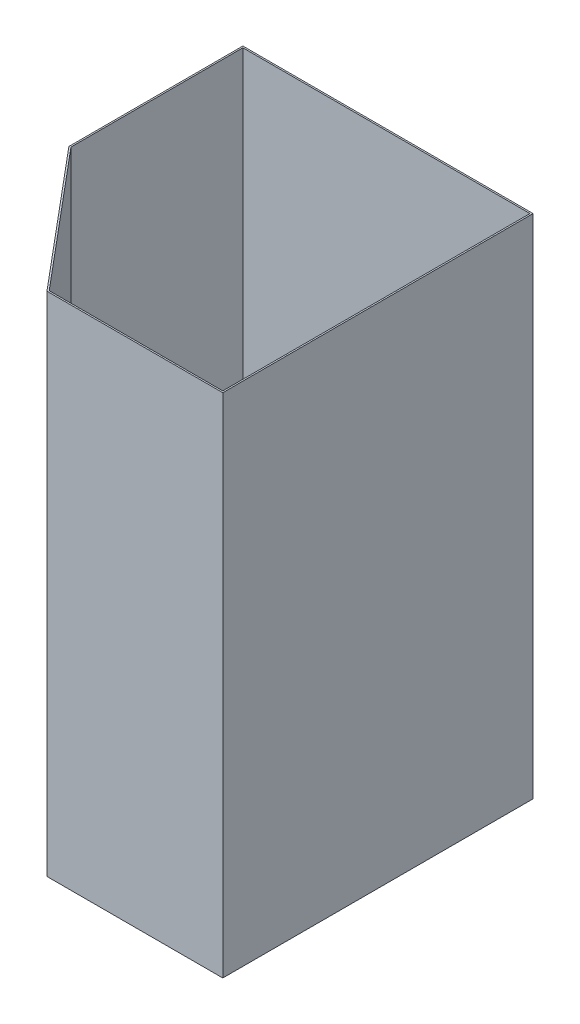
ISO-10303-21;
HEADER;
FILE_DESCRIPTION(('STEP AP214'),'2;1');
FILE_NAME('part.step','',(''),(''),'','','');
FILE_SCHEMA(('AUTOMOTIVE_DESIGN { 1 0 10303 214 1 1 1 1 }'));
ENDSEC;
DATA;
#1=APPLICATION_CONTEXT('core data for automotive mechanical design processes');
#2=APPLICATION_PROTOCOL_DEFINITION('international standard','automotive_design',2000,#1);
#3=PRODUCT_CONTEXT('',#1,'mechanical');
#4=PRODUCT('Part','Part','',(#3));
#5=PRODUCT_RELATED_PRODUCT_CATEGORY('part','',(#4));
#6=PRODUCT_DEFINITION_FORMATION('','',#4);
#7=PRODUCT_DEFINITION_CONTEXT('part definition',#1,'design');
#8=PRODUCT_DEFINITION('design','',#6,#7);
#9=PRODUCT_DEFINITION_SHAPE('','',#8);
#10=(LENGTH_UNIT() NAMED_UNIT(*) SI_UNIT(.MILLI.,.METRE.));
#11=(NAMED_UNIT(*) PLANE_ANGLE_UNIT() SI_UNIT($,.RADIAN.));
#12=(NAMED_UNIT(*) SI_UNIT($,.STERADIAN.) SOLID_ANGLE_UNIT());
#13=UNCERTAINTY_MEASURE_WITH_UNIT(LENGTH_MEASURE(1.E-05),#10,'distance_accuracy_value','');
#14=(GEOMETRIC_REPRESENTATION_CONTEXT(3) GLOBAL_UNCERTAINTY_ASSIGNED_CONTEXT((#13)) GLOBAL_UNIT_ASSIGNED_CONTEXT((#10,
#11,#12)) REPRESENTATION_CONTEXT('',''));
#15=CARTESIAN_POINT('',(0.,0.,0.));
#16=DIRECTION('',(0.,0.,1.));
#17=DIRECTION('',(1.,0.,0.));
#18=AXIS2_PLACEMENT_3D('',#15,#16,#17);
#19=CARTESIAN_POINT('',(0.,330.,0.));
#20=DIRECTION('',(0.,1.,0.));
#21=DIRECTION('',(0.,0.,1.));
#22=AXIS2_PLACEMENT_3D('',#19,#20,#21);
#23=PLANE('',#22);
#24=DIRECTION('',(0.,0.,-1.));
#25=VECTOR('',#24,1.);
#26=CARTESIAN_POINT('',(1.,330.,0.));
#27=LINE('',#26,#25);
#28=CARTESIAN_POINT('',(1.,330.,1.));
#29=VERTEX_POINT('',#28);
#30=CARTESIAN_POINT('',(1.,330.,-201.));
#31=VERTEX_POINT('',#30);
#32=EDGE_CURVE('E186',#29,#31,#27,.T.);
#33=ORIENTED_EDGE('',*,*,#32,.T.);
#34=DIRECTION('',(-1.,0.,0.));
#35=VECTOR('',#34,1.);
#36=CARTESIAN_POINT('',(0.,330.,-201.));
#37=LINE('',#36,#35);
#38=CARTESIAN_POINT('',(-187.920575113952,330.,-201.));
#39=VERTEX_POINT('',#38);
#40=EDGE_CURVE('E189',#31,#39,#37,.T.);
#41=ORIENTED_EDGE('',*,*,#40,.T.);
#42=DIRECTION('',(0.,0.,1.));
#43=VECTOR('',#42,1.);
#44=CARTESIAN_POINT('',(-187.920575113952,330.,0.));
#45=LINE('',#44,#43);
#46=CARTESIAN_POINT('',(-187.920575113952,330.,-87.7311407244164));
#47=VERTEX_POINT('',#46);
#48=EDGE_CURVE('E192',#39,#47,#45,.T.);
#49=ORIENTED_EDGE('',*,*,#48,.T.);
#50=DIRECTION('',(0.642787609686538,0.,0.766044443118979));
#51=VECTOR('',#50,1.);
#52=CARTESIAN_POINT('',(-67.0771664813008,330.,56.2844256548763));
#53=LINE('',#52,#51);
#54=CARTESIAN_POINT('',(-113.466307658155,330.,1.00000000000001));
#55=VERTEX_POINT('',#54);
#56=EDGE_CURVE('E194',#47,#55,#53,.T.);
#57=ORIENTED_EDGE('',*,*,#56,.T.);
#58=DIRECTION('',(1.,0.,0.));
#59=VECTOR('',#58,1.);
#60=CARTESIAN_POINT('',(0.,330.,1.));
#61=LINE('',#60,#59);
#62=EDGE_CURVE('E196',#55,#29,#61,.T.);
#63=ORIENTED_EDGE('',*,*,#62,.T.);
#64=EDGE_LOOP('',(#33,#41,#49,#57,#63));
#65=FACE_BOUND('',#64,.T.);
#66=DIRECTION('',(-1.,0.,0.));
#67=VECTOR('',#66,1.);
#68=CARTESIAN_POINT('',(-186.920575113952,330.,-200.));
#69=LINE('',#68,#67);
#70=CARTESIAN_POINT('',(0.,330.,-200.));
#71=VERTEX_POINT('',#70);
#72=CARTESIAN_POINT('',(-186.920575113952,330.,-200.));
#73=VERTEX_POINT('',#72);
#74=EDGE_CURVE('E150',#71,#73,#69,.T.);
#75=ORIENTED_EDGE('',*,*,#74,.F.);
#76=DIRECTION('',(0.,0.,-1.));
#77=VECTOR('',#76,1.);
#78=CARTESIAN_POINT('',(0.,330.,-200.));
#79=LINE('',#78,#77);
#80=CARTESIAN_POINT('',(0.,330.,0.));
#81=VERTEX_POINT('',#80);
#82=EDGE_CURVE('E142',#81,#71,#79,.T.);
#83=ORIENTED_EDGE('',*,*,#82,.F.);
#84=DIRECTION('',(1.,0.,0.));
#85=VECTOR('',#84,1.);
#86=CARTESIAN_POINT('',(0.,330.,0.));
#87=LINE('',#86,#85);
#88=CARTESIAN_POINT('',(-113.,330.,0.));
#89=VERTEX_POINT('',#88);
#90=EDGE_CURVE('E169',#89,#81,#87,.T.);
#91=ORIENTED_EDGE('',*,*,#90,.F.);
#92=DIRECTION('',(0.642787609686538,0.,0.766044443118979));
#93=VECTOR('',#92,1.);
#94=CARTESIAN_POINT('',(-113.,330.,0.));
#95=LINE('',#94,#93);
#96=CARTESIAN_POINT('',(-186.920575113952,330.,-88.0951109586826));
#97=VERTEX_POINT('',#96);
#98=EDGE_CURVE('E165',#97,#89,#95,.T.);
#99=ORIENTED_EDGE('',*,*,#98,.F.);
#100=DIRECTION('',(0.,0.,1.));
#101=VECTOR('',#100,1.);
#102=CARTESIAN_POINT('',(-186.920575113952,330.,-88.0951109586826));
#103=LINE('',#102,#101);
#104=EDGE_CURVE('E163',#73,#97,#103,.T.);
#105=ORIENTED_EDGE('',*,*,#104,.F.);
#106=EDGE_LOOP('',(#75,#83,#91,#99,#105));
#107=FACE_BOUND('',#106,.T.);
#108=ADVANCED_FACE('F65',(#65,#107),#23,.T.);
#109=CARTESIAN_POINT('',(0.,0.,0.));
#110=DIRECTION('',(0.,1.,0.));
#111=DIRECTION('',(0.,0.,1.));
#112=AXIS2_PLACEMENT_3D('',#109,#110,#111);
#113=PLANE('',#112);
#114=DIRECTION('',(0.,0.,-1.));
#115=VECTOR('',#114,1.);
#116=CARTESIAN_POINT('',(1.,0.,0.));
#117=LINE('',#116,#115);
#118=CARTESIAN_POINT('',(1.,0.,1.));
#119=VERTEX_POINT('',#118);
#120=CARTESIAN_POINT('',(1.,0.,-201.));
#121=VERTEX_POINT('',#120);
#122=EDGE_CURVE('E158',#119,#121,#117,.T.);
#123=ORIENTED_EDGE('',*,*,#122,.F.);
#124=DIRECTION('',(1.,0.,0.));
#125=VECTOR('',#124,1.);
#126=CARTESIAN_POINT('',(0.,0.,1.));
#127=LINE('',#126,#125);
#128=CARTESIAN_POINT('',(-113.466307658155,0.,1.00000000000001));
#129=VERTEX_POINT('',#128);
#130=EDGE_CURVE('E190',#129,#119,#127,.T.);
#131=ORIENTED_EDGE('',*,*,#130,.F.);
#132=DIRECTION('',(0.642787609686538,0.,0.766044443118979));
#133=VECTOR('',#132,1.);
#134=CARTESIAN_POINT('',(-67.0771664813008,0.,56.2844256548763));
#135=LINE('',#134,#133);
#136=CARTESIAN_POINT('',(-187.920575113952,0.,-87.7311407244164));
#137=VERTEX_POINT('',#136);
#138=EDGE_CURVE('E205',#137,#129,#135,.T.);
#139=ORIENTED_EDGE('',*,*,#138,.F.);
#140=DIRECTION('',(0.,0.,1.));
#141=VECTOR('',#140,1.);
#142=CARTESIAN_POINT('',(-187.920575113952,0.,0.));
#143=LINE('',#142,#141);
#144=CARTESIAN_POINT('',(-187.920575113952,0.,-201.));
#145=VERTEX_POINT('',#144);
#146=EDGE_CURVE('E203',#145,#137,#143,.T.);
#147=ORIENTED_EDGE('',*,*,#146,.F.);
#148=DIRECTION('',(-1.,0.,0.));
#149=VECTOR('',#148,1.);
#150=CARTESIAN_POINT('',(0.,0.,-201.));
#151=LINE('',#150,#149);
#152=EDGE_CURVE('E201',#121,#145,#151,.T.);
#153=ORIENTED_EDGE('',*,*,#152,.F.);
#154=EDGE_LOOP('',(#123,#131,#139,#147,#153));
#155=FACE_BOUND('',#154,.T.);
#156=DIRECTION('',(0.,0.,-1.));
#157=VECTOR('',#156,1.);
#158=CARTESIAN_POINT('',(0.,0.,-200.));
#159=LINE('',#158,#157);
#160=CARTESIAN_POINT('',(0.,0.,0.));
#161=VERTEX_POINT('',#160);
#162=CARTESIAN_POINT('',(0.,0.,-200.));
#163=VERTEX_POINT('',#162);
#164=EDGE_CURVE('E88',#161,#163,#159,.T.);
#165=ORIENTED_EDGE('',*,*,#164,.T.);
#166=DIRECTION('',(-1.,0.,0.));
#167=VECTOR('',#166,1.);
#168=CARTESIAN_POINT('',(-186.920575113952,0.,-200.));
#169=LINE('',#168,#167);
#170=CARTESIAN_POINT('',(-186.920575113952,0.,-200.));
#171=VERTEX_POINT('',#170);
#172=EDGE_CURVE('E157',#163,#171,#169,.T.);
#173=ORIENTED_EDGE('',*,*,#172,.T.);
#174=DIRECTION('',(0.,0.,1.));
#175=VECTOR('',#174,1.);
#176=CARTESIAN_POINT('',(-186.920575113952,0.,-88.0951109586826));
#177=LINE('',#176,#175);
#178=CARTESIAN_POINT('',(-186.920575113952,0.,-88.0951109586826));
#179=VERTEX_POINT('',#178);
#180=EDGE_CURVE('E173',#171,#179,#177,.T.);
#181=ORIENTED_EDGE('',*,*,#180,.T.);
#182=DIRECTION('',(0.642787609686538,0.,0.766044443118979));
#183=VECTOR('',#182,1.);
#184=CARTESIAN_POINT('',(-113.,0.,0.));
#185=LINE('',#184,#183);
#186=CARTESIAN_POINT('',(-113.,0.,0.));
#187=VERTEX_POINT('',#186);
#188=EDGE_CURVE('E176',#179,#187,#185,.T.);
#189=ORIENTED_EDGE('',*,*,#188,.T.);
#190=DIRECTION('',(1.,0.,0.));
#191=VECTOR('',#190,1.);
#192=CARTESIAN_POINT('',(0.,0.,0.));
#193=LINE('',#192,#191);
#194=EDGE_CURVE('E151',#187,#161,#193,.T.);
#195=ORIENTED_EDGE('',*,*,#194,.T.);
#196=EDGE_LOOP('',(#165,#173,#181,#189,#195));
#197=FACE_BOUND('',#196,.T.);
#198=ADVANCED_FACE('F226',(#155,#197),#113,.F.);
#199=CARTESIAN_POINT('',(1.,330.,0.));
#200=DIRECTION('',(-1.,0.,0.));
#201=DIRECTION('',(0.,0.,1.));
#202=AXIS2_PLACEMENT_3D('',#199,#200,#201);
#203=PLANE('',#202);
#204=ORIENTED_EDGE('',*,*,#122,.T.);
#205=DIRECTION('',(0.,-1.,0.));
#206=VECTOR('',#205,1.);
#207=CARTESIAN_POINT('',(1.,330.,-201.));
#208=LINE('',#207,#206);
#209=EDGE_CURVE('E12',#31,#121,#208,.T.);
#210=ORIENTED_EDGE('',*,*,#209,.F.);
#211=ORIENTED_EDGE('',*,*,#32,.F.);
#212=DIRECTION('',(0.,-1.,0.));
#213=VECTOR('',#212,1.);
#214=CARTESIAN_POINT('',(1.,330.,1.));
#215=LINE('',#214,#213);
#216=EDGE_CURVE('E198',#29,#119,#215,.T.);
#217=ORIENTED_EDGE('',*,*,#216,.T.);
#218=EDGE_LOOP('',(#204,#210,#211,#217));
#219=FACE_BOUND('',#218,.T.);
#220=ADVANCED_FACE('F67',(#219),#203,.F.);
#221=CARTESIAN_POINT('',(0.,330.,-201.));
#222=DIRECTION('',(0.,0.,1.));
#223=DIRECTION('',(1.,0.,0.));
#224=AXIS2_PLACEMENT_3D('',#221,#222,#223);
#225=PLANE('',#224);
#226=ORIENTED_EDGE('',*,*,#152,.T.);
#227=DIRECTION('',(0.,-1.,0.));
#228=VECTOR('',#227,1.);
#229=CARTESIAN_POINT('',(-187.920575113952,330.,-201.));
#230=LINE('',#229,#228);
#231=EDGE_CURVE('E73',#39,#145,#230,.T.);
#232=ORIENTED_EDGE('',*,*,#231,.F.);
#233=ORIENTED_EDGE('',*,*,#40,.F.);
#234=ORIENTED_EDGE('',*,*,#209,.T.);
#235=EDGE_LOOP('',(#226,#232,#233,#234));
#236=FACE_BOUND('',#235,.T.);
#237=ADVANCED_FACE('F240',(#236),#225,.F.);
#238=CARTESIAN_POINT('',(-187.920575113952,330.,0.));
#239=DIRECTION('',(1.,0.,0.));
#240=DIRECTION('',(0.,0.,-1.));
#241=AXIS2_PLACEMENT_3D('',#238,#239,#240);
#242=PLANE('',#241);
#243=ORIENTED_EDGE('',*,*,#146,.T.);
#244=DIRECTION('',(0.,-1.,0.));
#245=VECTOR('',#244,1.);
#246=CARTESIAN_POINT('',(-187.920575113952,330.,-87.7311407244164));
#247=LINE('',#246,#245);
#248=EDGE_CURVE('E213',#47,#137,#247,.T.);
#249=ORIENTED_EDGE('',*,*,#248,.F.);
#250=ORIENTED_EDGE('',*,*,#48,.F.);
#251=ORIENTED_EDGE('',*,*,#231,.T.);
#252=EDGE_LOOP('',(#243,#249,#250,#251));
#253=FACE_BOUND('',#252,.T.);
#254=ADVANCED_FACE('F220',(#253),#242,.F.);
#255=CARTESIAN_POINT('',(-67.0771664813008,330.,56.2844256548763));
#256=DIRECTION('',(0.766044443118979,0.,-0.642787609686538));
#257=DIRECTION('',(-0.642787609686538,0.,-0.766044443118979));
#258=AXIS2_PLACEMENT_3D('',#255,#256,#257);
#259=PLANE('',#258);
#260=ORIENTED_EDGE('',*,*,#138,.T.);
#261=DIRECTION('',(0.,-1.,0.));
#262=VECTOR('',#261,1.);
#263=CARTESIAN_POINT('',(-113.466307658155,330.,1.00000000000001));
#264=LINE('',#263,#262);
#265=EDGE_CURVE('E210',#55,#129,#264,.T.);
#266=ORIENTED_EDGE('',*,*,#265,.F.);
#267=ORIENTED_EDGE('',*,*,#56,.F.);
#268=ORIENTED_EDGE('',*,*,#248,.T.);
#269=EDGE_LOOP('',(#260,#266,#267,#268));
#270=FACE_BOUND('',#269,.T.);
#271=ADVANCED_FACE('F231',(#270),#259,.F.);
#272=CARTESIAN_POINT('',(0.,330.,1.));
#273=DIRECTION('',(0.,0.,-1.));
#274=DIRECTION('',(-1.,0.,0.));
#275=AXIS2_PLACEMENT_3D('',#272,#273,#274);
#276=PLANE('',#275);
#277=ORIENTED_EDGE('',*,*,#130,.T.);
#278=ORIENTED_EDGE('',*,*,#216,.F.);
#279=ORIENTED_EDGE('',*,*,#62,.F.);
#280=ORIENTED_EDGE('',*,*,#265,.T.);
#281=EDGE_LOOP('',(#277,#278,#279,#280));
#282=FACE_BOUND('',#281,.T.);
#283=ADVANCED_FACE('F235',(#282),#276,.F.);
#284=CARTESIAN_POINT('',(0.,330.,-200.));
#285=DIRECTION('',(-1.,0.,0.));
#286=DIRECTION('',(0.,0.,1.));
#287=AXIS2_PLACEMENT_3D('',#284,#285,#286);
#288=PLANE('',#287);
#289=ORIENTED_EDGE('',*,*,#164,.F.);
#290=DIRECTION('',(0.,-1.,0.));
#291=VECTOR('',#290,1.);
#292=CARTESIAN_POINT('',(0.,330.,0.));
#293=LINE('',#292,#291);
#294=EDGE_CURVE('E146',#81,#161,#293,.T.);
#295=ORIENTED_EDGE('',*,*,#294,.F.);
#296=ORIENTED_EDGE('',*,*,#82,.T.);
#297=DIRECTION('',(0.,-1.,0.));
#298=VECTOR('',#297,1.);
#299=CARTESIAN_POINT('',(0.,330.,-200.));
#300=LINE('',#299,#298);
#301=EDGE_CURVE('E145',#71,#163,#300,.T.);
#302=ORIENTED_EDGE('',*,*,#301,.T.);
#303=EDGE_LOOP('',(#289,#295,#296,#302));
#304=FACE_BOUND('',#303,.T.);
#305=ADVANCED_FACE('F144',(#304),#288,.T.);
#306=CARTESIAN_POINT('',(-186.920575113952,330.,-200.));
#307=DIRECTION('',(0.,0.,1.));
#308=DIRECTION('',(1.,0.,0.));
#309=AXIS2_PLACEMENT_3D('',#306,#307,#308);
#310=PLANE('',#309);
#311=ORIENTED_EDGE('',*,*,#172,.F.);
#312=ORIENTED_EDGE('',*,*,#301,.F.);
#313=ORIENTED_EDGE('',*,*,#74,.T.);
#314=DIRECTION('',(0.,-1.,0.));
#315=VECTOR('',#314,1.);
#316=CARTESIAN_POINT('',(-186.920575113952,330.,-200.));
#317=LINE('',#316,#315);
#318=EDGE_CURVE('E159',#73,#171,#317,.T.);
#319=ORIENTED_EDGE('',*,*,#318,.T.);
#320=EDGE_LOOP('',(#311,#312,#313,#319));
#321=FACE_BOUND('',#320,.T.);
#322=ADVANCED_FACE('F154',(#321),#310,.T.);
#323=CARTESIAN_POINT('',(-186.920575113952,330.,-88.0951109586826));
#324=DIRECTION('',(1.,0.,0.));
#325=DIRECTION('',(0.,0.,-1.));
#326=AXIS2_PLACEMENT_3D('',#323,#324,#325);
#327=PLANE('',#326);
#328=ORIENTED_EDGE('',*,*,#180,.F.);
#329=ORIENTED_EDGE('',*,*,#318,.F.);
#330=ORIENTED_EDGE('',*,*,#104,.T.);
#331=DIRECTION('',(0.,-1.,0.));
#332=VECTOR('',#331,1.);
#333=CARTESIAN_POINT('',(-186.920575113952,330.,-88.0951109586826));
#334=LINE('',#333,#332);
#335=EDGE_CURVE('E183',#97,#179,#334,.T.);
#336=ORIENTED_EDGE('',*,*,#335,.T.);
#337=EDGE_LOOP('',(#328,#329,#330,#336));
#338=FACE_BOUND('',#337,.T.);
#339=ADVANCED_FACE('F283',(#338),#327,.T.);
#340=CARTESIAN_POINT('',(-113.,330.,0.));
#341=DIRECTION('',(0.766044443118979,0.,-0.642787609686538));
#342=DIRECTION('',(-0.642787609686538,0.,-0.766044443118979));
#343=AXIS2_PLACEMENT_3D('',#340,#341,#342);
#344=PLANE('',#343);
#345=ORIENTED_EDGE('',*,*,#188,.F.);
#346=ORIENTED_EDGE('',*,*,#335,.F.);
#347=ORIENTED_EDGE('',*,*,#98,.T.);
#348=DIRECTION('',(0.,-1.,0.));
#349=VECTOR('',#348,1.);
#350=CARTESIAN_POINT('',(-113.,330.,0.));
#351=LINE('',#350,#349);
#352=EDGE_CURVE('E80',#89,#187,#351,.T.);
#353=ORIENTED_EDGE('',*,*,#352,.T.);
#354=EDGE_LOOP('',(#345,#346,#347,#353));
#355=FACE_BOUND('',#354,.T.);
#356=ADVANCED_FACE('F289',(#355),#344,.T.);
#357=CARTESIAN_POINT('',(0.,330.,0.));
#358=DIRECTION('',(0.,0.,-1.));
#359=DIRECTION('',(-1.,0.,0.));
#360=AXIS2_PLACEMENT_3D('',#357,#358,#359);
#361=PLANE('',#360);
#362=ORIENTED_EDGE('',*,*,#194,.F.);
#363=ORIENTED_EDGE('',*,*,#352,.F.);
#364=ORIENTED_EDGE('',*,*,#90,.T.);
#365=ORIENTED_EDGE('',*,*,#294,.T.);
#366=EDGE_LOOP('',(#362,#363,#364,#365));
#367=FACE_BOUND('',#366,.T.);
#368=ADVANCED_FACE('F297',(#367),#361,.T.);
#369=CLOSED_SHELL('',(#108,#198,#220,#237,#254,#271,#283,#305,#322,#339,#356,#368));
#370=MANIFOLD_SOLID_BREP('B2',#369);
#371=ADVANCED_BREP_SHAPE_REPRESENTATION('',(#18,#370),#14);
#372=SHAPE_DEFINITION_REPRESENTATION(#9,#371);
ENDSEC;
END-ISO-10303-21;
